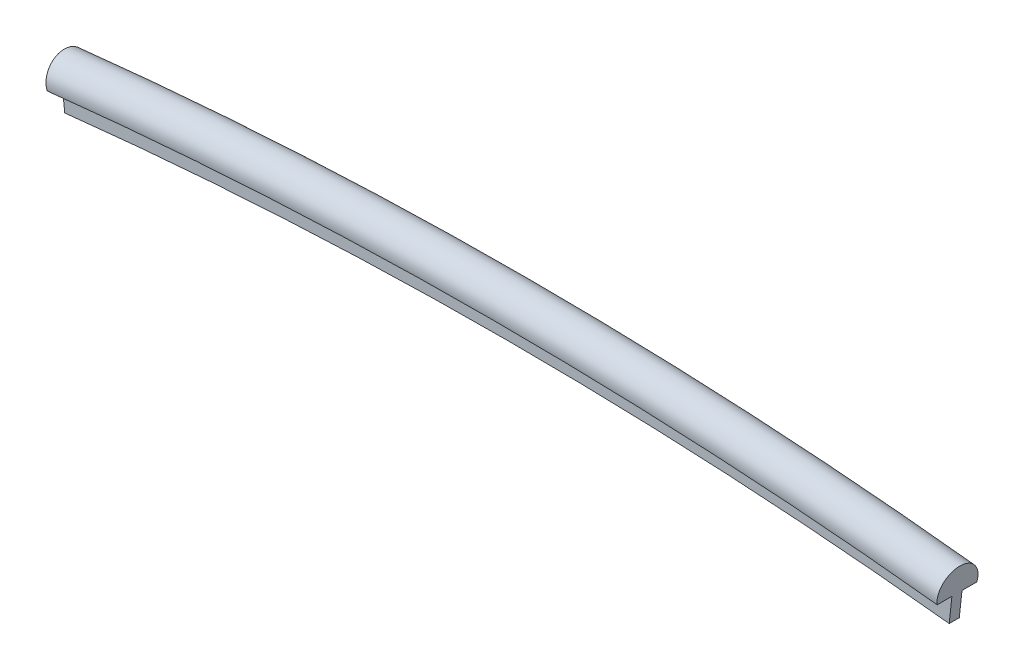
ISO-10303-21;
HEADER;
FILE_DESCRIPTION(('STEP AP214'),'2;1');
FILE_NAME('part.step','',(''),(''),'','','');
FILE_SCHEMA(('AUTOMOTIVE_DESIGN { 1 0 10303 214 1 1 1 1 }'));
ENDSEC;
DATA;
#1=APPLICATION_CONTEXT('core data for automotive mechanical design processes');
#2=APPLICATION_PROTOCOL_DEFINITION('international standard','automotive_design',2000,#1);
#3=PRODUCT_CONTEXT('',#1,'mechanical');
#4=PRODUCT('Part','Part','',(#3));
#5=PRODUCT_RELATED_PRODUCT_CATEGORY('part','',(#4));
#6=PRODUCT_DEFINITION_FORMATION('','',#4);
#7=PRODUCT_DEFINITION_CONTEXT('part definition',#1,'design');
#8=PRODUCT_DEFINITION('design','',#6,#7);
#9=PRODUCT_DEFINITION_SHAPE('','',#8);
#10=(LENGTH_UNIT() NAMED_UNIT(*) SI_UNIT(.MILLI.,.METRE.));
#11=(NAMED_UNIT(*) PLANE_ANGLE_UNIT() SI_UNIT($,.RADIAN.));
#12=(NAMED_UNIT(*) SI_UNIT($,.STERADIAN.) SOLID_ANGLE_UNIT());
#13=UNCERTAINTY_MEASURE_WITH_UNIT(LENGTH_MEASURE(1.E-05),#10,'distance_accuracy_value','');
#14=(GEOMETRIC_REPRESENTATION_CONTEXT(3) GLOBAL_UNCERTAINTY_ASSIGNED_CONTEXT((#13)) GLOBAL_UNIT_ASSIGNED_CONTEXT((#10,
#11,#12)) REPRESENTATION_CONTEXT('',''));
#15=CARTESIAN_POINT('',(0.,0.,0.));
#16=DIRECTION('',(0.,0.,1.));
#17=DIRECTION('',(1.,0.,0.));
#18=AXIS2_PLACEMENT_3D('',#15,#16,#17);
#19=CARTESIAN_POINT('',(0.,0.,70.5976415970385));
#20=DIRECTION('',(0.,0.,1.));
#21=DIRECTION('',(1.,0.,0.));
#22=AXIS2_PLACEMENT_3D('',#19,#20,#21);
#23=CYLINDRICAL_SURFACE('',#22,241.3);
#24=CARTESIAN_POINT('',(0.,0.,1.18));
#25=DIRECTION('',(0.,0.,1.));
#26=DIRECTION('',(1.,0.,0.));
#27=AXIS2_PLACEMENT_3D('',#24,#25,#26);
#28=CIRCLE('',#27,241.3);
#29=CARTESIAN_POINT('',(26.516362947322,239.838638455204,1.18));
#30=VERTEX_POINT('',#29);
#31=CARTESIAN_POINT('',(-26.516362947322,239.838638455204,1.18));
#32=VERTEX_POINT('',#31);
#33=EDGE_CURVE('E11',#30,#32,#28,.T.);
#34=ORIENTED_EDGE('',*,*,#33,.T.);
#35=DIRECTION('',(0.,0.,-1.));
#36=VECTOR('',#35,1.);
#37=CARTESIAN_POINT('',(-26.516362947322,239.838638455204,1.18));
#38=LINE('',#37,#36);
#39=CARTESIAN_POINT('',(-26.516362947322,239.838638455204,0.3));
#40=VERTEX_POINT('',#39);
#41=EDGE_CURVE('E103',#32,#40,#38,.T.);
#42=ORIENTED_EDGE('',*,*,#41,.T.);
#43=CARTESIAN_POINT('',(0.,0.,0.299999999999995));
#44=DIRECTION('',(0.,0.,1.));
#45=DIRECTION('',(1.,0.,0.));
#46=AXIS2_PLACEMENT_3D('',#43,#44,#45);
#47=CIRCLE('',#46,241.3);
#48=CARTESIAN_POINT('',(26.516362947322,239.838638455204,0.3));
#49=VERTEX_POINT('',#48);
#50=EDGE_CURVE('E85',#49,#40,#47,.T.);
#51=ORIENTED_EDGE('',*,*,#50,.F.);
#52=DIRECTION('',(0.,0.,-1.));
#53=VECTOR('',#52,1.);
#54=CARTESIAN_POINT('',(26.516362947322,239.838638455204,1.18));
#55=LINE('',#54,#53);
#56=EDGE_CURVE('E117',#30,#49,#55,.T.);
#57=ORIENTED_EDGE('',*,*,#56,.F.);
#58=EDGE_LOOP('',(#34,#42,#51,#57));
#59=FACE_BOUND('',#58,.T.);
#60=ADVANCED_FACE('F33',(#59),#23,.F.);
#61=CARTESIAN_POINT('',(0.,0.,0.));
#62=DIRECTION('',(0.,0.,1.));
#63=DIRECTION('',(1.,0.,0.));
#64=AXIS2_PLACEMENT_3D('',#61,#62,#63);
#65=TOROIDAL_SURFACE('',#64,241.586013989906,1.21416802890791);
#66=CARTESIAN_POINT('',(0.,0.,-1.18));
#67=DIRECTION('',(0.,0.,1.));
#68=DIRECTION('',(1.,0.,0.));
#69=AXIS2_PLACEMENT_3D('',#66,#67,#68);
#70=CIRCLE('',#69,241.3);
#71=CARTESIAN_POINT('',(26.516362947322,239.838638455204,-1.18));
#72=VERTEX_POINT('',#71);
#73=CARTESIAN_POINT('',(-26.516362947322,239.838638455204,-1.18));
#74=VERTEX_POINT('',#73);
#75=EDGE_CURVE('E41',#72,#74,#70,.T.);
#76=ORIENTED_EDGE('',*,*,#75,.T.);
#77=CARTESIAN_POINT('',(-26.5477929131917,240.12292028661,0.));
#78=DIRECTION('',(0.993943797990898,0.109889610225122,0.));
#79=DIRECTION('',(0.,0.,1.));
#80=AXIS2_PLACEMENT_3D('',#77,#78,#79);
#81=CIRCLE('',#80,1.21416802890791);
#82=EDGE_CURVE('E115',#74,#32,#81,.T.);
#83=ORIENTED_EDGE('',*,*,#82,.T.);
#84=ORIENTED_EDGE('',*,*,#33,.F.);
#85=CARTESIAN_POINT('',(26.5477929131917,240.12292028661,0.));
#86=DIRECTION('',(0.993943797990898,-0.109889610225122,0.));
#87=DIRECTION('',(0.,0.,1.));
#88=AXIS2_PLACEMENT_3D('',#85,#86,#87);
#89=CIRCLE('',#88,1.21416802890791);
#90=EDGE_CURVE('E97',#72,#30,#89,.T.);
#91=ORIENTED_EDGE('',*,*,#90,.F.);
#92=EDGE_LOOP('',(#76,#83,#84,#91));
#93=FACE_BOUND('',#92,.T.);
#94=ADVANCED_FACE('F35',(#93),#65,.T.);
#95=CARTESIAN_POINT('',(0.,0.,70.5976415970385));
#96=DIRECTION('',(0.,0.,1.));
#97=DIRECTION('',(1.,0.,0.));
#98=AXIS2_PLACEMENT_3D('',#95,#96,#97);
#99=CYLINDRICAL_SURFACE('',#98,241.3);
#100=CARTESIAN_POINT('',(0.,0.,-0.299999999999995));
#101=DIRECTION('',(0.,0.,1.));
#102=DIRECTION('',(1.,0.,0.));
#103=AXIS2_PLACEMENT_3D('',#100,#101,#102);
#104=CIRCLE('',#103,241.3);
#105=CARTESIAN_POINT('',(26.516362947322,239.838638455204,-0.3));
#106=VERTEX_POINT('',#105);
#107=CARTESIAN_POINT('',(-26.516362947322,239.838638455204,-0.3));
#108=VERTEX_POINT('',#107);
#109=EDGE_CURVE('E132',#106,#108,#104,.T.);
#110=ORIENTED_EDGE('',*,*,#109,.T.);
#111=DIRECTION('',(0.,0.,-1.));
#112=VECTOR('',#111,1.);
#113=CARTESIAN_POINT('',(-26.516362947322,239.838638455204,-0.3));
#114=LINE('',#113,#112);
#115=EDGE_CURVE('E113',#108,#74,#114,.T.);
#116=ORIENTED_EDGE('',*,*,#115,.T.);
#117=ORIENTED_EDGE('',*,*,#75,.F.);
#118=DIRECTION('',(0.,0.,-1.));
#119=VECTOR('',#118,1.);
#120=CARTESIAN_POINT('',(26.516362947322,239.838638455204,-0.3));
#121=LINE('',#120,#119);
#122=EDGE_CURVE('E125',#106,#72,#121,.T.);
#123=ORIENTED_EDGE('',*,*,#122,.F.);
#124=EDGE_LOOP('',(#110,#116,#117,#123));
#125=FACE_BOUND('',#124,.T.);
#126=ADVANCED_FACE('F134',(#125),#99,.F.);
#127=CARTESIAN_POINT('',(26.3515285319843,238.347722758217,-0.3));
#128=DIRECTION('',(0.,0.,1.));
#129=DIRECTION('',(1.,0.,0.));
#130=AXIS2_PLACEMENT_3D('',#127,#128,#129);
#131=PLANE('',#130);
#132=CARTESIAN_POINT('',(0.,0.,-0.299999999999995));
#133=DIRECTION('',(0.,0.,1.));
#134=DIRECTION('',(1.,0.,0.));
#135=AXIS2_PLACEMENT_3D('',#132,#133,#134);
#136=CIRCLE('',#135,239.8);
#137=CARTESIAN_POINT('',(26.3515285319843,238.347722758217,-0.3));
#138=VERTEX_POINT('',#137);
#139=CARTESIAN_POINT('',(-26.3515285319843,238.347722758217,-0.3));
#140=VERTEX_POINT('',#139);
#141=EDGE_CURVE('E129',#138,#140,#136,.T.);
#142=ORIENTED_EDGE('',*,*,#141,.T.);
#143=DIRECTION('',(-0.109889610225122,0.993943797990898,0.));
#144=VECTOR('',#143,1.);
#145=CARTESIAN_POINT('',(-26.3515285319843,238.347722758217,-0.3));
#146=LINE('',#145,#144);
#147=EDGE_CURVE('E110',#140,#108,#146,.T.);
#148=ORIENTED_EDGE('',*,*,#147,.T.);
#149=ORIENTED_EDGE('',*,*,#109,.F.);
#150=DIRECTION('',(0.109889610225122,0.993943797990898,0.));
#151=VECTOR('',#150,1.);
#152=CARTESIAN_POINT('',(26.3515285319843,238.347722758217,-0.3));
#153=LINE('',#152,#151);
#154=EDGE_CURVE('E122',#138,#106,#153,.T.);
#155=ORIENTED_EDGE('',*,*,#154,.F.);
#156=EDGE_LOOP('',(#142,#148,#149,#155));
#157=FACE_BOUND('',#156,.T.);
#158=ADVANCED_FACE('F136',(#157),#131,.F.);
#159=CARTESIAN_POINT('',(0.,0.,70.5976415970385));
#160=DIRECTION('',(0.,0.,1.));
#161=DIRECTION('',(1.,0.,0.));
#162=AXIS2_PLACEMENT_3D('',#159,#160,#161);
#163=CYLINDRICAL_SURFACE('',#162,239.8);
#164=CARTESIAN_POINT('',(0.,0.,0.299999999999995));
#165=DIRECTION('',(0.,0.,1.));
#166=DIRECTION('',(1.,0.,0.));
#167=AXIS2_PLACEMENT_3D('',#164,#165,#166);
#168=CIRCLE('',#167,239.8);
#169=CARTESIAN_POINT('',(26.3515285319843,238.347722758217,0.3));
#170=VERTEX_POINT('',#169);
#171=CARTESIAN_POINT('',(-26.3515285319843,238.347722758217,0.3));
#172=VERTEX_POINT('',#171);
#173=EDGE_CURVE('E96',#170,#172,#168,.T.);
#174=ORIENTED_EDGE('',*,*,#173,.T.);
#175=DIRECTION('',(0.,0.,-1.));
#176=VECTOR('',#175,1.);
#177=CARTESIAN_POINT('',(-26.3515285319843,238.347722758217,0.));
#178=LINE('',#177,#176);
#179=EDGE_CURVE('E105',#172,#140,#178,.T.);
#180=ORIENTED_EDGE('',*,*,#179,.T.);
#181=ORIENTED_EDGE('',*,*,#141,.F.);
#182=DIRECTION('',(0.,0.,-1.));
#183=VECTOR('',#182,1.);
#184=CARTESIAN_POINT('',(26.3515285319843,238.347722758217,0.));
#185=LINE('',#184,#183);
#186=EDGE_CURVE('E120',#170,#138,#185,.T.);
#187=ORIENTED_EDGE('',*,*,#186,.F.);
#188=EDGE_LOOP('',(#174,#180,#181,#187));
#189=FACE_BOUND('',#188,.T.);
#190=ADVANCED_FACE('F141',(#189),#163,.F.);
#191=CARTESIAN_POINT('',(26.3515285319843,238.347722758217,0.3));
#192=DIRECTION('',(0.,0.,-1.));
#193=DIRECTION('',(-1.,0.,0.));
#194=AXIS2_PLACEMENT_3D('',#191,#192,#193);
#195=PLANE('',#194);
#196=DIRECTION('',(-0.109889610225122,-0.993943797990898,0.));
#197=VECTOR('',#196,1.);
#198=CARTESIAN_POINT('',(26.3515285319843,238.347722758217,0.3));
#199=LINE('',#198,#197);
#200=EDGE_CURVE('E91',#49,#170,#199,.T.);
#201=ORIENTED_EDGE('',*,*,#200,.F.);
#202=ORIENTED_EDGE('',*,*,#50,.T.);
#203=DIRECTION('',(0.109889610225122,-0.993943797990898,0.));
#204=VECTOR('',#203,1.);
#205=CARTESIAN_POINT('',(-26.3515285319843,238.347722758217,0.3));
#206=LINE('',#205,#204);
#207=EDGE_CURVE('E88',#40,#172,#206,.T.);
#208=ORIENTED_EDGE('',*,*,#207,.T.);
#209=ORIENTED_EDGE('',*,*,#173,.F.);
#210=EDGE_LOOP('',(#201,#202,#208,#209));
#211=FACE_BOUND('',#210,.T.);
#212=ADVANCED_FACE('F87',(#211),#195,.F.);
#213=CARTESIAN_POINT('',(26.5477929131917,240.12292028661,0.));
#214=DIRECTION('',(-0.993943797990898,0.109889610225122,0.));
#215=DIRECTION('',(0.,0.,1.));
#216=AXIS2_PLACEMENT_3D('',#213,#214,#215);
#217=PLANE('',#216);
#218=ORIENTED_EDGE('',*,*,#56,.T.);
#219=ORIENTED_EDGE('',*,*,#200,.T.);
#220=ORIENTED_EDGE('',*,*,#186,.T.);
#221=ORIENTED_EDGE('',*,*,#154,.T.);
#222=ORIENTED_EDGE('',*,*,#122,.T.);
#223=ORIENTED_EDGE('',*,*,#90,.T.);
#224=EDGE_LOOP('',(#218,#219,#220,#221,#222,#223));
#225=FACE_BOUND('',#224,.T.);
#226=ADVANCED_FACE('F143',(#225),#217,.F.);
#227=CARTESIAN_POINT('',(-26.5477929131917,240.12292028661,0.));
#228=DIRECTION('',(-0.993943797990898,-0.109889610225122,0.));
#229=DIRECTION('',(0.,0.,1.));
#230=AXIS2_PLACEMENT_3D('',#227,#228,#229);
#231=PLANE('',#230);
#232=ORIENTED_EDGE('',*,*,#41,.F.);
#233=ORIENTED_EDGE('',*,*,#82,.F.);
#234=ORIENTED_EDGE('',*,*,#115,.F.);
#235=ORIENTED_EDGE('',*,*,#147,.F.);
#236=ORIENTED_EDGE('',*,*,#179,.F.);
#237=ORIENTED_EDGE('',*,*,#207,.F.);
#238=EDGE_LOOP('',(#232,#233,#234,#235,#236,#237));
#239=FACE_BOUND('',#238,.T.);
#240=ADVANCED_FACE('F101',(#239),#231,.T.);
#241=CLOSED_SHELL('',(#60,#94,#126,#158,#190,#212,#226,#240));
#242=MANIFOLD_SOLID_BREP('B2',#241);
#243=ADVANCED_BREP_SHAPE_REPRESENTATION('',(#18,#242),#14);
#244=SHAPE_DEFINITION_REPRESENTATION(#9,#243);
ENDSEC;
END-ISO-10303-21;
